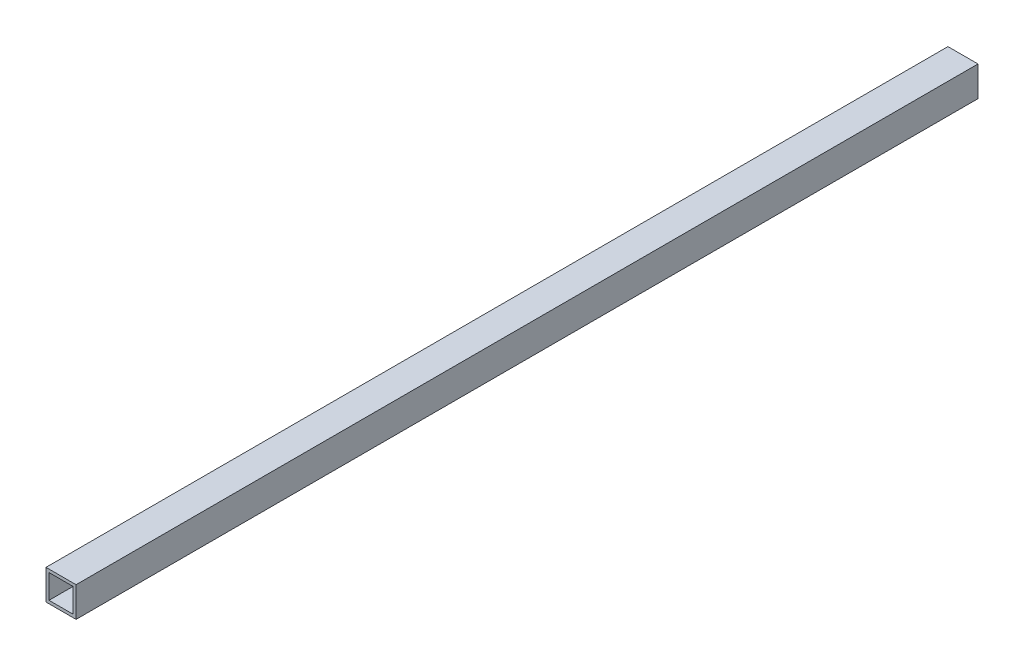
ISO-10303-21;
HEADER;
FILE_DESCRIPTION(('STEP AP214'),'2;1');
FILE_NAME('part.step','',(''),(''),'','','');
FILE_SCHEMA(('AUTOMOTIVE_DESIGN { 1 0 10303 214 1 1 1 1 }'));
ENDSEC;
DATA;
#1=APPLICATION_CONTEXT('core data for automotive mechanical design processes');
#2=APPLICATION_PROTOCOL_DEFINITION('international standard','automotive_design',2000,#1);
#3=PRODUCT_CONTEXT('',#1,'mechanical');
#4=PRODUCT('Part','Part','',(#3));
#5=PRODUCT_RELATED_PRODUCT_CATEGORY('part','',(#4));
#6=PRODUCT_DEFINITION_FORMATION('','',#4);
#7=PRODUCT_DEFINITION_CONTEXT('part definition',#1,'design');
#8=PRODUCT_DEFINITION('design','',#6,#7);
#9=PRODUCT_DEFINITION_SHAPE('','',#8);
#10=(LENGTH_UNIT() NAMED_UNIT(*) SI_UNIT(.MILLI.,.METRE.));
#11=(NAMED_UNIT(*) PLANE_ANGLE_UNIT() SI_UNIT($,.RADIAN.));
#12=(NAMED_UNIT(*) SI_UNIT($,.STERADIAN.) SOLID_ANGLE_UNIT());
#13=UNCERTAINTY_MEASURE_WITH_UNIT(LENGTH_MEASURE(1.E-05),#10,'distance_accuracy_value','');
#14=(GEOMETRIC_REPRESENTATION_CONTEXT(3) GLOBAL_UNCERTAINTY_ASSIGNED_CONTEXT((#13)) GLOBAL_UNIT_ASSIGNED_CONTEXT((#10,
#11,#12)) REPRESENTATION_CONTEXT('',''));
#15=CARTESIAN_POINT('',(0.,0.,0.));
#16=DIRECTION('',(0.,0.,1.));
#17=DIRECTION('',(1.,0.,0.));
#18=AXIS2_PLACEMENT_3D('',#15,#16,#17);
#19=CARTESIAN_POINT('',(0.,0.,600.));
#20=DIRECTION('',(0.,0.,-1.));
#21=DIRECTION('',(-1.,0.,0.));
#22=AXIS2_PLACEMENT_3D('',#19,#20,#21);
#23=PLANE('',#22);
#24=DIRECTION('',(0.,1.,0.));
#25=VECTOR('',#24,1.);
#26=CARTESIAN_POINT('',(10.,-10.,600.));
#27=LINE('',#26,#25);
#28=CARTESIAN_POINT('',(10.,-10.,600.));
#29=VERTEX_POINT('',#28);
#30=CARTESIAN_POINT('',(10.,10.,600.));
#31=VERTEX_POINT('',#30);
#32=EDGE_CURVE('E135',#29,#31,#27,.T.);
#33=ORIENTED_EDGE('',*,*,#32,.T.);
#34=DIRECTION('',(-1.,0.,0.));
#35=VECTOR('',#34,1.);
#36=CARTESIAN_POINT('',(-10.,10.,600.));
#37=LINE('',#36,#35);
#38=CARTESIAN_POINT('',(-10.,10.,600.));
#39=VERTEX_POINT('',#38);
#40=EDGE_CURVE('E138',#31,#39,#37,.T.);
#41=ORIENTED_EDGE('',*,*,#40,.T.);
#42=DIRECTION('',(0.,-1.,0.));
#43=VECTOR('',#42,1.);
#44=CARTESIAN_POINT('',(-10.,-10.,600.));
#45=LINE('',#44,#43);
#46=CARTESIAN_POINT('',(-10.,-10.,600.));
#47=VERTEX_POINT('',#46);
#48=EDGE_CURVE('E141',#39,#47,#45,.T.);
#49=ORIENTED_EDGE('',*,*,#48,.T.);
#50=DIRECTION('',(1.,0.,0.));
#51=VECTOR('',#50,1.);
#52=CARTESIAN_POINT('',(-10.,-10.,600.));
#53=LINE('',#52,#51);
#54=EDGE_CURVE('E143',#47,#29,#53,.T.);
#55=ORIENTED_EDGE('',*,*,#54,.T.);
#56=EDGE_LOOP('',(#33,#41,#49,#55));
#57=FACE_BOUND('',#56,.T.);
#58=DIRECTION('',(0.,1.,0.));
#59=VECTOR('',#58,1.);
#60=CARTESIAN_POINT('',(8.,-8.,600.));
#61=LINE('',#60,#59);
#62=CARTESIAN_POINT('',(8.,-8.,600.));
#63=VERTEX_POINT('',#62);
#64=CARTESIAN_POINT('',(8.,8.,600.));
#65=VERTEX_POINT('',#64);
#66=EDGE_CURVE('E99',#63,#65,#61,.T.);
#67=ORIENTED_EDGE('',*,*,#66,.F.);
#68=DIRECTION('',(1.,0.,0.));
#69=VECTOR('',#68,1.);
#70=CARTESIAN_POINT('',(-8.,-8.,600.));
#71=LINE('',#70,#69);
#72=CARTESIAN_POINT('',(-8.,-8.,600.));
#73=VERTEX_POINT('',#72);
#74=EDGE_CURVE('E121',#73,#63,#71,.T.);
#75=ORIENTED_EDGE('',*,*,#74,.F.);
#76=DIRECTION('',(0.,-1.,0.));
#77=VECTOR('',#76,1.);
#78=CARTESIAN_POINT('',(-8.,-8.,600.));
#79=LINE('',#78,#77);
#80=CARTESIAN_POINT('',(-8.,8.,600.));
#81=VERTEX_POINT('',#80);
#82=EDGE_CURVE('E119',#81,#73,#79,.T.);
#83=ORIENTED_EDGE('',*,*,#82,.F.);
#84=DIRECTION('',(-1.,0.,0.));
#85=VECTOR('',#84,1.);
#86=CARTESIAN_POINT('',(-8.,8.,600.));
#87=LINE('',#86,#85);
#88=EDGE_CURVE('E107',#65,#81,#87,.T.);
#89=ORIENTED_EDGE('',*,*,#88,.F.);
#90=EDGE_LOOP('',(#67,#75,#83,#89));
#91=FACE_BOUND('',#90,.T.);
#92=ADVANCED_FACE('F34',(#57,#91),#23,.F.);
#93=CARTESIAN_POINT('',(0.,0.,0.));
#94=DIRECTION('',(0.,0.,-1.));
#95=DIRECTION('',(-1.,0.,0.));
#96=AXIS2_PLACEMENT_3D('',#93,#94,#95);
#97=PLANE('',#96);
#98=DIRECTION('',(0.,1.,0.));
#99=VECTOR('',#98,1.);
#100=CARTESIAN_POINT('',(10.,-10.,0.));
#101=LINE('',#100,#99);
#102=CARTESIAN_POINT('',(10.,-10.,0.));
#103=VERTEX_POINT('',#102);
#104=CARTESIAN_POINT('',(10.,10.,0.));
#105=VERTEX_POINT('',#104);
#106=EDGE_CURVE('E115',#103,#105,#101,.T.);
#107=ORIENTED_EDGE('',*,*,#106,.F.);
#108=DIRECTION('',(1.,0.,0.));
#109=VECTOR('',#108,1.);
#110=CARTESIAN_POINT('',(-10.,-10.,0.));
#111=LINE('',#110,#109);
#112=CARTESIAN_POINT('',(-10.,-10.,0.));
#113=VERTEX_POINT('',#112);
#114=EDGE_CURVE('E139',#113,#103,#111,.T.);
#115=ORIENTED_EDGE('',*,*,#114,.F.);
#116=DIRECTION('',(0.,-1.,0.));
#117=VECTOR('',#116,1.);
#118=CARTESIAN_POINT('',(-10.,-10.,0.));
#119=LINE('',#118,#117);
#120=CARTESIAN_POINT('',(-10.,10.,0.));
#121=VERTEX_POINT('',#120);
#122=EDGE_CURVE('E150',#121,#113,#119,.T.);
#123=ORIENTED_EDGE('',*,*,#122,.F.);
#124=DIRECTION('',(-1.,0.,0.));
#125=VECTOR('',#124,1.);
#126=CARTESIAN_POINT('',(-10.,10.,0.));
#127=LINE('',#126,#125);
#128=EDGE_CURVE('E148',#105,#121,#127,.T.);
#129=ORIENTED_EDGE('',*,*,#128,.F.);
#130=EDGE_LOOP('',(#107,#115,#123,#129));
#131=FACE_BOUND('',#130,.T.);
#132=DIRECTION('',(1.,0.,0.));
#133=VECTOR('',#132,1.);
#134=CARTESIAN_POINT('',(-8.,-8.,0.));
#135=LINE('',#134,#133);
#136=CARTESIAN_POINT('',(-8.,-8.,0.));
#137=VERTEX_POINT('',#136);
#138=CARTESIAN_POINT('',(8.,-8.,0.));
#139=VERTEX_POINT('',#138);
#140=EDGE_CURVE('E108',#137,#139,#135,.T.);
#141=ORIENTED_EDGE('',*,*,#140,.T.);
#142=DIRECTION('',(0.,1.,0.));
#143=VECTOR('',#142,1.);
#144=CARTESIAN_POINT('',(8.,-8.,0.));
#145=LINE('',#144,#143);
#146=CARTESIAN_POINT('',(8.,8.,0.));
#147=VERTEX_POINT('',#146);
#148=EDGE_CURVE('E57',#139,#147,#145,.T.);
#149=ORIENTED_EDGE('',*,*,#148,.T.);
#150=DIRECTION('',(-1.,0.,0.));
#151=VECTOR('',#150,1.);
#152=CARTESIAN_POINT('',(-8.,8.,0.));
#153=LINE('',#152,#151);
#154=CARTESIAN_POINT('',(-8.,8.,0.));
#155=VERTEX_POINT('',#154);
#156=EDGE_CURVE('E114',#147,#155,#153,.T.);
#157=ORIENTED_EDGE('',*,*,#156,.T.);
#158=DIRECTION('',(0.,-1.,0.));
#159=VECTOR('',#158,1.);
#160=CARTESIAN_POINT('',(-8.,-8.,0.));
#161=LINE('',#160,#159);
#162=EDGE_CURVE('E127',#155,#137,#161,.T.);
#163=ORIENTED_EDGE('',*,*,#162,.T.);
#164=EDGE_LOOP('',(#141,#149,#157,#163));
#165=FACE_BOUND('',#164,.T.);
#166=ADVANCED_FACE('F168',(#131,#165),#97,.T.);
#167=CARTESIAN_POINT('',(10.,-10.,600.));
#168=DIRECTION('',(-1.,0.,0.));
#169=DIRECTION('',(0.,0.,1.));
#170=AXIS2_PLACEMENT_3D('',#167,#168,#169);
#171=PLANE('',#170);
#172=ORIENTED_EDGE('',*,*,#106,.T.);
#173=DIRECTION('',(0.,0.,-1.));
#174=VECTOR('',#173,1.);
#175=CARTESIAN_POINT('',(10.,10.,600.));
#176=LINE('',#175,#174);
#177=EDGE_CURVE('E11',#31,#105,#176,.T.);
#178=ORIENTED_EDGE('',*,*,#177,.F.);
#179=ORIENTED_EDGE('',*,*,#32,.F.);
#180=DIRECTION('',(0.,0.,-1.));
#181=VECTOR('',#180,1.);
#182=CARTESIAN_POINT('',(10.,-10.,600.));
#183=LINE('',#182,#181);
#184=EDGE_CURVE('E145',#29,#103,#183,.T.);
#185=ORIENTED_EDGE('',*,*,#184,.T.);
#186=EDGE_LOOP('',(#172,#178,#179,#185));
#187=FACE_BOUND('',#186,.T.);
#188=ADVANCED_FACE('F36',(#187),#171,.F.);
#189=CARTESIAN_POINT('',(-10.,10.,600.));
#190=DIRECTION('',(0.,-1.,0.));
#191=DIRECTION('',(0.,0.,-1.));
#192=AXIS2_PLACEMENT_3D('',#189,#190,#191);
#193=PLANE('',#192);
#194=ORIENTED_EDGE('',*,*,#128,.T.);
#195=DIRECTION('',(0.,0.,-1.));
#196=VECTOR('',#195,1.);
#197=CARTESIAN_POINT('',(-10.,10.,600.));
#198=LINE('',#197,#196);
#199=EDGE_CURVE('E42',#39,#121,#198,.T.);
#200=ORIENTED_EDGE('',*,*,#199,.F.);
#201=ORIENTED_EDGE('',*,*,#40,.F.);
#202=ORIENTED_EDGE('',*,*,#177,.T.);
#203=EDGE_LOOP('',(#194,#200,#201,#202));
#204=FACE_BOUND('',#203,.T.);
#205=ADVANCED_FACE('F178',(#204),#193,.F.);
#206=CARTESIAN_POINT('',(-10.,-10.,600.));
#207=DIRECTION('',(1.,0.,0.));
#208=DIRECTION('',(0.,0.,-1.));
#209=AXIS2_PLACEMENT_3D('',#206,#207,#208);
#210=PLANE('',#209);
#211=ORIENTED_EDGE('',*,*,#122,.T.);
#212=DIRECTION('',(0.,0.,-1.));
#213=VECTOR('',#212,1.);
#214=CARTESIAN_POINT('',(-10.,-10.,600.));
#215=LINE('',#214,#213);
#216=EDGE_CURVE('E155',#47,#113,#215,.T.);
#217=ORIENTED_EDGE('',*,*,#216,.F.);
#218=ORIENTED_EDGE('',*,*,#48,.F.);
#219=ORIENTED_EDGE('',*,*,#199,.T.);
#220=EDGE_LOOP('',(#211,#217,#218,#219));
#221=FACE_BOUND('',#220,.T.);
#222=ADVANCED_FACE('F162',(#221),#210,.F.);
#223=CARTESIAN_POINT('',(-10.,-10.,600.));
#224=DIRECTION('',(0.,1.,0.));
#225=DIRECTION('',(0.,0.,1.));
#226=AXIS2_PLACEMENT_3D('',#223,#224,#225);
#227=PLANE('',#226);
#228=ORIENTED_EDGE('',*,*,#114,.T.);
#229=ORIENTED_EDGE('',*,*,#184,.F.);
#230=ORIENTED_EDGE('',*,*,#54,.F.);
#231=ORIENTED_EDGE('',*,*,#216,.T.);
#232=EDGE_LOOP('',(#228,#229,#230,#231));
#233=FACE_BOUND('',#232,.T.);
#234=ADVANCED_FACE('F172',(#233),#227,.F.);
#235=CARTESIAN_POINT('',(8.,-8.,600.));
#236=DIRECTION('',(-1.,0.,0.));
#237=DIRECTION('',(0.,0.,1.));
#238=AXIS2_PLACEMENT_3D('',#235,#236,#237);
#239=PLANE('',#238);
#240=ORIENTED_EDGE('',*,*,#148,.F.);
#241=DIRECTION('',(0.,0.,-1.));
#242=VECTOR('',#241,1.);
#243=CARTESIAN_POINT('',(8.,-8.,600.));
#244=LINE('',#243,#242);
#245=EDGE_CURVE('E103',#63,#139,#244,.T.);
#246=ORIENTED_EDGE('',*,*,#245,.F.);
#247=ORIENTED_EDGE('',*,*,#66,.T.);
#248=DIRECTION('',(0.,0.,-1.));
#249=VECTOR('',#248,1.);
#250=CARTESIAN_POINT('',(8.,8.,600.));
#251=LINE('',#250,#249);
#252=EDGE_CURVE('E102',#65,#147,#251,.T.);
#253=ORIENTED_EDGE('',*,*,#252,.T.);
#254=EDGE_LOOP('',(#240,#246,#247,#253));
#255=FACE_BOUND('',#254,.T.);
#256=ADVANCED_FACE('F101',(#255),#239,.T.);
#257=CARTESIAN_POINT('',(-8.,8.,600.));
#258=DIRECTION('',(0.,-1.,0.));
#259=DIRECTION('',(0.,0.,-1.));
#260=AXIS2_PLACEMENT_3D('',#257,#258,#259);
#261=PLANE('',#260);
#262=ORIENTED_EDGE('',*,*,#156,.F.);
#263=ORIENTED_EDGE('',*,*,#252,.F.);
#264=ORIENTED_EDGE('',*,*,#88,.T.);
#265=DIRECTION('',(0.,0.,-1.));
#266=VECTOR('',#265,1.);
#267=CARTESIAN_POINT('',(-8.,8.,600.));
#268=LINE('',#267,#266);
#269=EDGE_CURVE('E116',#81,#155,#268,.T.);
#270=ORIENTED_EDGE('',*,*,#269,.T.);
#271=EDGE_LOOP('',(#262,#263,#264,#270));
#272=FACE_BOUND('',#271,.T.);
#273=ADVANCED_FACE('F111',(#272),#261,.T.);
#274=CARTESIAN_POINT('',(-8.,-8.,600.));
#275=DIRECTION('',(1.,0.,0.));
#276=DIRECTION('',(0.,0.,-1.));
#277=AXIS2_PLACEMENT_3D('',#274,#275,#276);
#278=PLANE('',#277);
#279=ORIENTED_EDGE('',*,*,#162,.F.);
#280=ORIENTED_EDGE('',*,*,#269,.F.);
#281=ORIENTED_EDGE('',*,*,#82,.T.);
#282=DIRECTION('',(0.,0.,-1.));
#283=VECTOR('',#282,1.);
#284=CARTESIAN_POINT('',(-8.,-8.,600.));
#285=LINE('',#284,#283);
#286=EDGE_CURVE('E49',#73,#137,#285,.T.);
#287=ORIENTED_EDGE('',*,*,#286,.T.);
#288=EDGE_LOOP('',(#279,#280,#281,#287));
#289=FACE_BOUND('',#288,.T.);
#290=ADVANCED_FACE('F201',(#289),#278,.T.);
#291=CARTESIAN_POINT('',(-8.,-8.,600.));
#292=DIRECTION('',(0.,1.,0.));
#293=DIRECTION('',(0.,0.,1.));
#294=AXIS2_PLACEMENT_3D('',#291,#292,#293);
#295=PLANE('',#294);
#296=ORIENTED_EDGE('',*,*,#140,.F.);
#297=ORIENTED_EDGE('',*,*,#286,.F.);
#298=ORIENTED_EDGE('',*,*,#74,.T.);
#299=ORIENTED_EDGE('',*,*,#245,.T.);
#300=EDGE_LOOP('',(#296,#297,#298,#299));
#301=FACE_BOUND('',#300,.T.);
#302=ADVANCED_FACE('F205',(#301),#295,.T.);
#303=CLOSED_SHELL('',(#92,#166,#188,#205,#222,#234,#256,#273,#290,#302));
#304=MANIFOLD_SOLID_BREP('B2',#303);
#305=ADVANCED_BREP_SHAPE_REPRESENTATION('',(#18,#304),#14);
#306=SHAPE_DEFINITION_REPRESENTATION(#9,#305);
ENDSEC;
END-ISO-10303-21;
